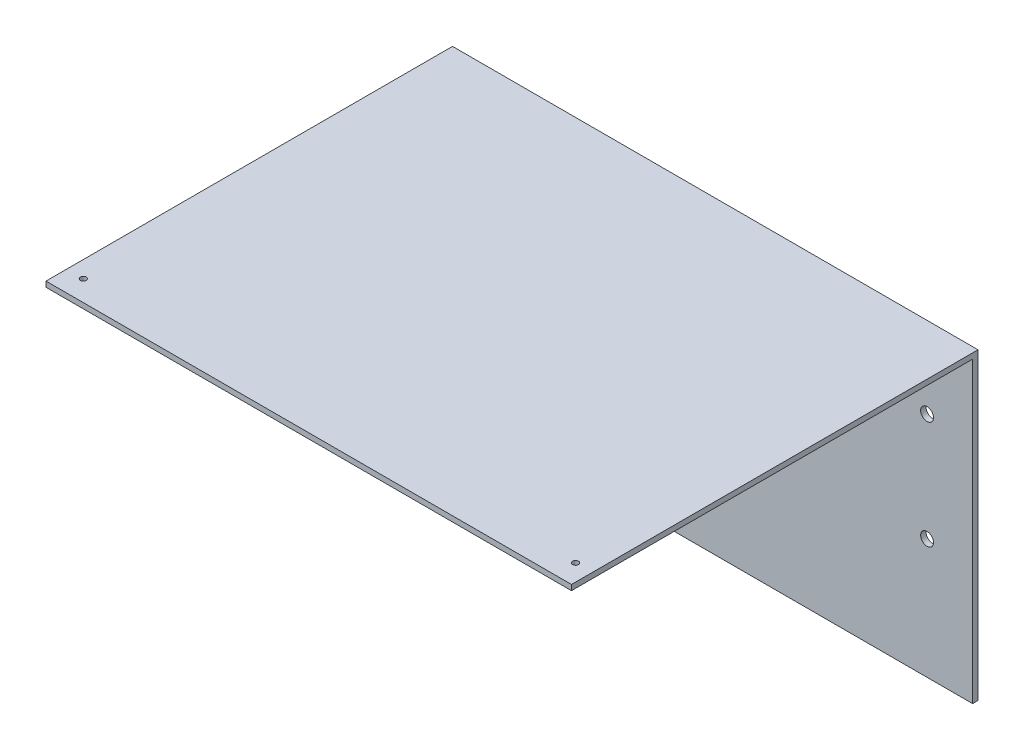
ISO-10303-21;
HEADER;
FILE_DESCRIPTION(('STEP AP214'),'2;1');
FILE_NAME('part.step','',(''),(''),'','','');
FILE_SCHEMA(('AUTOMOTIVE_DESIGN { 1 0 10303 214 1 1 1 1 }'));
ENDSEC;
DATA;
#1=APPLICATION_CONTEXT('core data for automotive mechanical design processes');
#2=APPLICATION_PROTOCOL_DEFINITION('international standard','automotive_design',2000,#1);
#3=PRODUCT_CONTEXT('',#1,'mechanical');
#4=PRODUCT('Part','Part','',(#3));
#5=PRODUCT_RELATED_PRODUCT_CATEGORY('part','',(#4));
#6=PRODUCT_DEFINITION_FORMATION('','',#4);
#7=PRODUCT_DEFINITION_CONTEXT('part definition',#1,'design');
#8=PRODUCT_DEFINITION('design','',#6,#7);
#9=PRODUCT_DEFINITION_SHAPE('','',#8);
#10=(LENGTH_UNIT() NAMED_UNIT(*) SI_UNIT(.MILLI.,.METRE.));
#11=(NAMED_UNIT(*) PLANE_ANGLE_UNIT() SI_UNIT($,.RADIAN.));
#12=(NAMED_UNIT(*) SI_UNIT($,.STERADIAN.) SOLID_ANGLE_UNIT());
#13=UNCERTAINTY_MEASURE_WITH_UNIT(LENGTH_MEASURE(1.E-05),#10,'distance_accuracy_value','');
#14=(GEOMETRIC_REPRESENTATION_CONTEXT(3) GLOBAL_UNCERTAINTY_ASSIGNED_CONTEXT((#13)) GLOBAL_UNIT_ASSIGNED_CONTEXT((#10,
#11,#12)) REPRESENTATION_CONTEXT('',''));
#15=CARTESIAN_POINT('',(0.,0.,0.));
#16=DIRECTION('',(0.,0.,1.));
#17=DIRECTION('',(1.,0.,0.));
#18=AXIS2_PLACEMENT_3D('',#15,#16,#17);
#19=CARTESIAN_POINT('',(0.,0.,3.));
#20=DIRECTION('',(0.,-1.,0.));
#21=DIRECTION('',(0.,0.,-1.));
#22=AXIS2_PLACEMENT_3D('',#19,#20,#21);
#23=PLANE('',#22);
#24=DIRECTION('',(-1.,0.,0.));
#25=VECTOR('',#24,1.);
#26=CARTESIAN_POINT('',(0.,0.,0.));
#27=LINE('',#26,#25);
#28=CARTESIAN_POINT('',(291.5,0.,0.));
#29=VERTEX_POINT('',#28);
#30=CARTESIAN_POINT('',(0.,0.,0.));
#31=VERTEX_POINT('',#30);
#32=EDGE_CURVE('E93',#29,#31,#27,.T.);
#33=ORIENTED_EDGE('',*,*,#32,.T.);
#34=DIRECTION('',(0.,0.,-1.));
#35=VECTOR('',#34,1.);
#36=CARTESIAN_POINT('',(0.,0.,3.));
#37=LINE('',#36,#35);
#38=CARTESIAN_POINT('',(0.,0.,225.5));
#39=VERTEX_POINT('',#38);
#40=EDGE_CURVE('E97',#39,#31,#37,.T.);
#41=ORIENTED_EDGE('',*,*,#40,.F.);
#42=DIRECTION('',(-1.,0.,0.));
#43=VECTOR('',#42,1.);
#44=CARTESIAN_POINT('',(0.,0.,225.5));
#45=LINE('',#44,#43);
#46=CARTESIAN_POINT('',(291.5,0.,225.5));
#47=VERTEX_POINT('',#46);
#48=EDGE_CURVE('E165',#47,#39,#45,.T.);
#49=ORIENTED_EDGE('',*,*,#48,.F.);
#50=DIRECTION('',(0.,0.,-1.));
#51=VECTOR('',#50,1.);
#52=CARTESIAN_POINT('',(291.5,0.,3.));
#53=LINE('',#52,#51);
#54=EDGE_CURVE('E100',#47,#29,#53,.T.);
#55=ORIENTED_EDGE('',*,*,#54,.T.);
#56=EDGE_LOOP('',(#33,#41,#49,#55));
#57=FACE_BOUND('',#56,.T.);
#58=CARTESIAN_POINT('',(282.25,0.,214.));
#59=DIRECTION('',(0.,1.,0.));
#60=DIRECTION('',(0.,0.,1.));
#61=AXIS2_PLACEMENT_3D('',#58,#59,#60);
#62=CIRCLE('',#61,1.64999999999998);
#63=CARTESIAN_POINT('',(282.25,0.,215.65));
#64=VERTEX_POINT('',#63);
#65=EDGE_CURVE('E217',#64,#64,#62,.T.);
#66=ORIENTED_EDGE('',*,*,#65,.F.);
#67=EDGE_LOOP('',(#66));
#68=FACE_BOUND('',#67,.T.);
#69=CARTESIAN_POINT('',(9.24999999999998,0.,214.));
#70=DIRECTION('',(0.,1.,0.));
#71=DIRECTION('',(0.,0.,1.));
#72=AXIS2_PLACEMENT_3D('',#69,#70,#71);
#73=CIRCLE('',#72,1.64999999999999);
#74=CARTESIAN_POINT('',(9.24999999999998,0.,215.65));
#75=VERTEX_POINT('',#74);
#76=EDGE_CURVE('E229',#75,#75,#73,.T.);
#77=ORIENTED_EDGE('',*,*,#76,.F.);
#78=EDGE_LOOP('',(#77));
#79=FACE_BOUND('',#78,.T.);
#80=ADVANCED_FACE('F51',(#57,#68,#79),#23,.F.);
#81=CARTESIAN_POINT('',(0.,0.,3.));
#82=DIRECTION('',(1.,0.,0.));
#83=DIRECTION('',(0.,1.,0.));
#84=AXIS2_PLACEMENT_3D('',#81,#82,#83);
#85=PLANE('',#84);
#86=DIRECTION('',(0.,-1.,0.));
#87=VECTOR('',#86,1.);
#88=CARTESIAN_POINT('',(0.,0.,0.));
#89=LINE('',#88,#87);
#90=CARTESIAN_POINT('',(0.,-168.5,0.));
#91=VERTEX_POINT('',#90);
#92=EDGE_CURVE('E112',#31,#91,#89,.T.);
#93=ORIENTED_EDGE('',*,*,#92,.T.);
#94=DIRECTION('',(0.,0.,-1.));
#95=VECTOR('',#94,1.);
#96=CARTESIAN_POINT('',(0.,-168.5,3.));
#97=LINE('',#96,#95);
#98=CARTESIAN_POINT('',(0.,-168.5,3.));
#99=VERTEX_POINT('',#98);
#100=EDGE_CURVE('E11',#99,#91,#97,.T.);
#101=ORIENTED_EDGE('',*,*,#100,.F.);
#102=DIRECTION('',(0.,-1.,0.));
#103=VECTOR('',#102,1.);
#104=CARTESIAN_POINT('',(0.,0.,3.));
#105=LINE('',#104,#103);
#106=CARTESIAN_POINT('',(0.,-3.,3.));
#107=VERTEX_POINT('',#106);
#108=EDGE_CURVE('E105',#107,#99,#105,.T.);
#109=ORIENTED_EDGE('',*,*,#108,.F.);
#110=DIRECTION('',(0.,0.,-1.));
#111=VECTOR('',#110,1.);
#112=CARTESIAN_POINT('',(0.,-3.,225.5));
#113=LINE('',#112,#111);
#114=CARTESIAN_POINT('',(0.,-3.,225.5));
#115=VERTEX_POINT('',#114);
#116=EDGE_CURVE('E146',#115,#107,#113,.T.);
#117=ORIENTED_EDGE('',*,*,#116,.F.);
#118=DIRECTION('',(0.,-1.,0.));
#119=VECTOR('',#118,1.);
#120=CARTESIAN_POINT('',(0.,0.,225.5));
#121=LINE('',#120,#119);
#122=EDGE_CURVE('E115',#39,#115,#121,.T.);
#123=ORIENTED_EDGE('',*,*,#122,.F.);
#124=ORIENTED_EDGE('',*,*,#40,.T.);
#125=EDGE_LOOP('',(#93,#101,#109,#117,#123,#124));
#126=FACE_BOUND('',#125,.T.);
#127=ADVANCED_FACE('F53',(#126),#85,.F.);
#128=CARTESIAN_POINT('',(0.,-168.5,3.));
#129=DIRECTION('',(0.,1.,0.));
#130=DIRECTION('',(0.,0.,1.));
#131=AXIS2_PLACEMENT_3D('',#128,#129,#130);
#132=PLANE('',#131);
#133=DIRECTION('',(1.,0.,0.));
#134=VECTOR('',#133,1.);
#135=CARTESIAN_POINT('',(0.,-168.5,0.));
#136=LINE('',#135,#134);
#137=CARTESIAN_POINT('',(291.5,-168.5,0.));
#138=VERTEX_POINT('',#137);
#139=EDGE_CURVE('E120',#91,#138,#136,.T.);
#140=ORIENTED_EDGE('',*,*,#139,.T.);
#141=DIRECTION('',(0.,0.,-1.));
#142=VECTOR('',#141,1.);
#143=CARTESIAN_POINT('',(291.5,-168.5,3.));
#144=LINE('',#143,#142);
#145=CARTESIAN_POINT('',(291.5,-168.5,3.));
#146=VERTEX_POINT('',#145);
#147=EDGE_CURVE('E60',#146,#138,#144,.T.);
#148=ORIENTED_EDGE('',*,*,#147,.F.);
#149=DIRECTION('',(1.,0.,0.));
#150=VECTOR('',#149,1.);
#151=CARTESIAN_POINT('',(0.,-168.5,3.));
#152=LINE('',#151,#150);
#153=EDGE_CURVE('E73',#99,#146,#152,.T.);
#154=ORIENTED_EDGE('',*,*,#153,.F.);
#155=ORIENTED_EDGE('',*,*,#100,.T.);
#156=EDGE_LOOP('',(#140,#148,#154,#155));
#157=FACE_BOUND('',#156,.T.);
#158=ADVANCED_FACE('F143',(#157),#132,.F.);
#159=CARTESIAN_POINT('',(291.5,0.,3.));
#160=DIRECTION('',(-1.,0.,0.));
#161=DIRECTION('',(0.,0.,1.));
#162=AXIS2_PLACEMENT_3D('',#159,#160,#161);
#163=PLANE('',#162);
#164=DIRECTION('',(0.,1.,0.));
#165=VECTOR('',#164,1.);
#166=CARTESIAN_POINT('',(291.5,0.,0.));
#167=LINE('',#166,#165);
#168=EDGE_CURVE('E106',#138,#29,#167,.T.);
#169=ORIENTED_EDGE('',*,*,#168,.T.);
#170=ORIENTED_EDGE('',*,*,#54,.F.);
#171=DIRECTION('',(0.,1.,0.));
#172=VECTOR('',#171,1.);
#173=CARTESIAN_POINT('',(291.5,0.,225.5));
#174=LINE('',#173,#172);
#175=CARTESIAN_POINT('',(291.5,-3.,225.5));
#176=VERTEX_POINT('',#175);
#177=EDGE_CURVE('E204',#176,#47,#174,.T.);
#178=ORIENTED_EDGE('',*,*,#177,.F.);
#179=DIRECTION('',(0.,0.,-1.));
#180=VECTOR('',#179,1.);
#181=CARTESIAN_POINT('',(291.5,-3.,225.5));
#182=LINE('',#181,#180);
#183=CARTESIAN_POINT('',(291.5,-3.,3.));
#184=VERTEX_POINT('',#183);
#185=EDGE_CURVE('E158',#176,#184,#182,.T.);
#186=ORIENTED_EDGE('',*,*,#185,.T.);
#187=DIRECTION('',(0.,1.,0.));
#188=VECTOR('',#187,1.);
#189=CARTESIAN_POINT('',(291.5,0.,3.));
#190=LINE('',#189,#188);
#191=EDGE_CURVE('E117',#146,#184,#190,.T.);
#192=ORIENTED_EDGE('',*,*,#191,.F.);
#193=ORIENTED_EDGE('',*,*,#147,.T.);
#194=EDGE_LOOP('',(#169,#170,#178,#186,#192,#193));
#195=FACE_BOUND('',#194,.T.);
#196=ADVANCED_FACE('F140',(#195),#163,.F.);
#197=CARTESIAN_POINT('',(0.,0.,3.));
#198=DIRECTION('',(0.,0.,1.));
#199=DIRECTION('',(1.,0.,0.));
#200=AXIS2_PLACEMENT_3D('',#197,#198,#199);
#201=PLANE('',#200);
#202=DIRECTION('',(1.,0.,0.));
#203=VECTOR('',#202,1.);
#204=CARTESIAN_POINT('',(0.,-3.,3.));
#205=LINE('',#204,#203);
#206=EDGE_CURVE('E67',#107,#184,#205,.T.);
#207=ORIENTED_EDGE('',*,*,#206,.F.);
#208=ORIENTED_EDGE('',*,*,#108,.T.);
#209=ORIENTED_EDGE('',*,*,#153,.T.);
#210=ORIENTED_EDGE('',*,*,#191,.T.);
#211=EDGE_LOOP('',(#207,#208,#209,#210));
#212=FACE_BOUND('',#211,.T.);
#213=CARTESIAN_POINT('',(25.25,-102.,3.));
#214=DIRECTION('',(0.,0.,1.));
#215=DIRECTION('',(1.,0.,0.));
#216=AXIS2_PLACEMENT_3D('',#213,#214,#215);
#217=CIRCLE('',#216,3.57124);
#218=CARTESIAN_POINT('',(28.82124,-102.,3.));
#219=VERTEX_POINT('',#218);
#220=EDGE_CURVE('E157',#219,#219,#217,.T.);
#221=ORIENTED_EDGE('',*,*,#220,.F.);
#222=EDGE_LOOP('',(#221));
#223=FACE_BOUND('',#222,.T.);
#224=CARTESIAN_POINT('',(25.25,-42.,3.));
#225=DIRECTION('',(0.,0.,1.));
#226=DIRECTION('',(1.,0.,0.));
#227=AXIS2_PLACEMENT_3D('',#224,#225,#226);
#228=CIRCLE('',#227,3.57124);
#229=CARTESIAN_POINT('',(28.82124,-42.,3.));
#230=VERTEX_POINT('',#229);
#231=EDGE_CURVE('E172',#230,#230,#228,.T.);
#232=ORIENTED_EDGE('',*,*,#231,.F.);
#233=EDGE_LOOP('',(#232));
#234=FACE_BOUND('',#233,.T.);
#235=CARTESIAN_POINT('',(266.25,-42.,3.));
#236=DIRECTION('',(0.,0.,1.));
#237=DIRECTION('',(1.,0.,0.));
#238=AXIS2_PLACEMENT_3D('',#235,#236,#237);
#239=CIRCLE('',#238,3.57123999999998);
#240=CARTESIAN_POINT('',(269.82124,-42.,3.));
#241=VERTEX_POINT('',#240);
#242=EDGE_CURVE('E180',#241,#241,#239,.T.);
#243=ORIENTED_EDGE('',*,*,#242,.F.);
#244=EDGE_LOOP('',(#243));
#245=FACE_BOUND('',#244,.T.);
#246=CARTESIAN_POINT('',(266.25,-102.,3.));
#247=DIRECTION('',(0.,0.,1.));
#248=DIRECTION('',(1.,0.,0.));
#249=AXIS2_PLACEMENT_3D('',#246,#247,#248);
#250=CIRCLE('',#249,3.57123999999998);
#251=CARTESIAN_POINT('',(269.82124,-102.,3.));
#252=VERTEX_POINT('',#251);
#253=EDGE_CURVE('E128',#252,#252,#250,.T.);
#254=ORIENTED_EDGE('',*,*,#253,.F.);
#255=EDGE_LOOP('',(#254));
#256=FACE_BOUND('',#255,.T.);
#257=ADVANCED_FACE('F192',(#212,#223,#234,#245,#256),#201,.T.);
#258=CARTESIAN_POINT('',(0.,0.,0.));
#259=DIRECTION('',(0.,0.,1.));
#260=DIRECTION('',(1.,0.,0.));
#261=AXIS2_PLACEMENT_3D('',#258,#259,#260);
#262=PLANE('',#261);
#263=CARTESIAN_POINT('',(25.25,-102.,0.));
#264=DIRECTION('',(0.,0.,1.));
#265=DIRECTION('',(1.,0.,0.));
#266=AXIS2_PLACEMENT_3D('',#263,#264,#265);
#267=CIRCLE('',#266,3.57124);
#268=CARTESIAN_POINT('',(28.82124,-102.,0.));
#269=VERTEX_POINT('',#268);
#270=EDGE_CURVE('E163',#269,#269,#267,.T.);
#271=ORIENTED_EDGE('',*,*,#270,.T.);
#272=EDGE_LOOP('',(#271));
#273=FACE_BOUND('',#272,.T.);
#274=CARTESIAN_POINT('',(25.25,-42.,0.));
#275=DIRECTION('',(0.,0.,1.));
#276=DIRECTION('',(1.,0.,0.));
#277=AXIS2_PLACEMENT_3D('',#274,#275,#276);
#278=CIRCLE('',#277,3.57124);
#279=CARTESIAN_POINT('',(28.82124,-42.,0.));
#280=VERTEX_POINT('',#279);
#281=EDGE_CURVE('E176',#280,#280,#278,.T.);
#282=ORIENTED_EDGE('',*,*,#281,.T.);
#283=EDGE_LOOP('',(#282));
#284=FACE_BOUND('',#283,.T.);
#285=CARTESIAN_POINT('',(266.25,-42.,0.));
#286=DIRECTION('',(0.,0.,1.));
#287=DIRECTION('',(1.,0.,0.));
#288=AXIS2_PLACEMENT_3D('',#285,#286,#287);
#289=CIRCLE('',#288,3.57123999999998);
#290=CARTESIAN_POINT('',(269.82124,-42.,0.));
#291=VERTEX_POINT('',#290);
#292=EDGE_CURVE('E184',#291,#291,#289,.T.);
#293=ORIENTED_EDGE('',*,*,#292,.T.);
#294=EDGE_LOOP('',(#293));
#295=FACE_BOUND('',#294,.T.);
#296=CARTESIAN_POINT('',(266.25,-102.,0.));
#297=DIRECTION('',(0.,0.,1.));
#298=DIRECTION('',(1.,0.,0.));
#299=AXIS2_PLACEMENT_3D('',#296,#297,#298);
#300=CIRCLE('',#299,3.57123999999998);
#301=CARTESIAN_POINT('',(269.82124,-102.,0.));
#302=VERTEX_POINT('',#301);
#303=EDGE_CURVE('E122',#302,#302,#300,.T.);
#304=ORIENTED_EDGE('',*,*,#303,.T.);
#305=EDGE_LOOP('',(#304));
#306=FACE_BOUND('',#305,.T.);
#307=ORIENTED_EDGE('',*,*,#92,.F.);
#308=ORIENTED_EDGE('',*,*,#32,.F.);
#309=ORIENTED_EDGE('',*,*,#168,.F.);
#310=ORIENTED_EDGE('',*,*,#139,.F.);
#311=EDGE_LOOP('',(#307,#308,#309,#310));
#312=FACE_BOUND('',#311,.T.);
#313=ADVANCED_FACE('F119',(#273,#284,#295,#306,#312),#262,.F.);
#314=CARTESIAN_POINT('',(266.25,-102.,3.));
#315=DIRECTION('',(0.,0.,1.));
#316=DIRECTION('',(1.,0.,0.));
#317=AXIS2_PLACEMENT_3D('',#314,#315,#316);
#318=CYLINDRICAL_SURFACE('',#317,3.57123999999998);
#319=ORIENTED_EDGE('',*,*,#303,.F.);
#320=EDGE_LOOP('',(#319));
#321=FACE_BOUND('',#320,.T.);
#322=ORIENTED_EDGE('',*,*,#253,.T.);
#323=EDGE_LOOP('',(#322));
#324=FACE_BOUND('',#323,.T.);
#325=ADVANCED_FACE('F259',(#321,#324),#318,.F.);
#326=CARTESIAN_POINT('',(266.25,-42.,3.));
#327=DIRECTION('',(0.,0.,1.));
#328=DIRECTION('',(1.,0.,0.));
#329=AXIS2_PLACEMENT_3D('',#326,#327,#328);
#330=CYLINDRICAL_SURFACE('',#329,3.57123999999998);
#331=ORIENTED_EDGE('',*,*,#292,.F.);
#332=EDGE_LOOP('',(#331));
#333=FACE_BOUND('',#332,.T.);
#334=ORIENTED_EDGE('',*,*,#242,.T.);
#335=EDGE_LOOP('',(#334));
#336=FACE_BOUND('',#335,.T.);
#337=ADVANCED_FACE('F268',(#333,#336),#330,.F.);
#338=CARTESIAN_POINT('',(25.25,-42.,3.));
#339=DIRECTION('',(0.,0.,1.));
#340=DIRECTION('',(1.,0.,0.));
#341=AXIS2_PLACEMENT_3D('',#338,#339,#340);
#342=CYLINDRICAL_SURFACE('',#341,3.57124);
#343=ORIENTED_EDGE('',*,*,#281,.F.);
#344=EDGE_LOOP('',(#343));
#345=FACE_BOUND('',#344,.T.);
#346=ORIENTED_EDGE('',*,*,#231,.T.);
#347=EDGE_LOOP('',(#346));
#348=FACE_BOUND('',#347,.T.);
#349=ADVANCED_FACE('F277',(#345,#348),#342,.F.);
#350=CARTESIAN_POINT('',(25.25,-102.,3.));
#351=DIRECTION('',(0.,0.,1.));
#352=DIRECTION('',(1.,0.,0.));
#353=AXIS2_PLACEMENT_3D('',#350,#351,#352);
#354=CYLINDRICAL_SURFACE('',#353,3.57124);
#355=ORIENTED_EDGE('',*,*,#270,.F.);
#356=EDGE_LOOP('',(#355));
#357=FACE_BOUND('',#356,.T.);
#358=ORIENTED_EDGE('',*,*,#220,.T.);
#359=EDGE_LOOP('',(#358));
#360=FACE_BOUND('',#359,.T.);
#361=ADVANCED_FACE('F286',(#357,#360),#354,.F.);
#362=CARTESIAN_POINT('',(0.,-3.,225.5));
#363=DIRECTION('',(0.,1.,0.));
#364=DIRECTION('',(0.,0.,1.));
#365=AXIS2_PLACEMENT_3D('',#362,#363,#364);
#366=PLANE('',#365);
#367=CARTESIAN_POINT('',(9.24999999999998,-3.,214.));
#368=DIRECTION('',(0.,1.,0.));
#369=DIRECTION('',(0.,0.,1.));
#370=AXIS2_PLACEMENT_3D('',#367,#368,#369);
#371=CIRCLE('',#370,1.64999999999999);
#372=CARTESIAN_POINT('',(9.24999999999998,-3.,215.65));
#373=VERTEX_POINT('',#372);
#374=EDGE_CURVE('E223',#373,#373,#371,.T.);
#375=ORIENTED_EDGE('',*,*,#374,.T.);
#376=EDGE_LOOP('',(#375));
#377=FACE_BOUND('',#376,.T.);
#378=CARTESIAN_POINT('',(282.25,-3.,214.));
#379=DIRECTION('',(0.,1.,0.));
#380=DIRECTION('',(0.,0.,1.));
#381=AXIS2_PLACEMENT_3D('',#378,#379,#380);
#382=CIRCLE('',#381,1.64999999999998);
#383=CARTESIAN_POINT('',(282.25,-3.,215.65));
#384=VERTEX_POINT('',#383);
#385=EDGE_CURVE('E213',#384,#384,#382,.T.);
#386=ORIENTED_EDGE('',*,*,#385,.T.);
#387=EDGE_LOOP('',(#386));
#388=FACE_BOUND('',#387,.T.);
#389=ORIENTED_EDGE('',*,*,#206,.T.);
#390=ORIENTED_EDGE('',*,*,#185,.F.);
#391=DIRECTION('',(1.,0.,0.));
#392=VECTOR('',#391,1.);
#393=CARTESIAN_POINT('',(0.,-3.,225.5));
#394=LINE('',#393,#392);
#395=EDGE_CURVE('E155',#115,#176,#394,.T.);
#396=ORIENTED_EDGE('',*,*,#395,.F.);
#397=ORIENTED_EDGE('',*,*,#116,.T.);
#398=EDGE_LOOP('',(#389,#390,#396,#397));
#399=FACE_BOUND('',#398,.T.);
#400=ADVANCED_FACE('F151',(#377,#388,#399),#366,.F.);
#401=CARTESIAN_POINT('',(0.,0.,225.5));
#402=DIRECTION('',(0.,0.,1.));
#403=DIRECTION('',(1.,0.,0.));
#404=AXIS2_PLACEMENT_3D('',#401,#402,#403);
#405=PLANE('',#404);
#406=ORIENTED_EDGE('',*,*,#122,.T.);
#407=ORIENTED_EDGE('',*,*,#395,.T.);
#408=ORIENTED_EDGE('',*,*,#177,.T.);
#409=ORIENTED_EDGE('',*,*,#48,.T.);
#410=EDGE_LOOP('',(#406,#407,#408,#409));
#411=FACE_BOUND('',#410,.T.);
#412=ADVANCED_FACE('F202',(#411),#405,.T.);
#413=CARTESIAN_POINT('',(282.25,0.,214.));
#414=DIRECTION('',(0.,1.,0.));
#415=DIRECTION('',(0.,0.,1.));
#416=AXIS2_PLACEMENT_3D('',#413,#414,#415);
#417=CYLINDRICAL_SURFACE('',#416,1.64999999999998);
#418=ORIENTED_EDGE('',*,*,#385,.F.);
#419=EDGE_LOOP('',(#418));
#420=FACE_BOUND('',#419,.T.);
#421=ORIENTED_EDGE('',*,*,#65,.T.);
#422=EDGE_LOOP('',(#421));
#423=FACE_BOUND('',#422,.T.);
#424=ADVANCED_FACE('F319',(#420,#423),#417,.F.);
#425=CARTESIAN_POINT('',(9.24999999999998,0.,214.));
#426=DIRECTION('',(0.,1.,0.));
#427=DIRECTION('',(0.,0.,1.));
#428=AXIS2_PLACEMENT_3D('',#425,#426,#427);
#429=CYLINDRICAL_SURFACE('',#428,1.64999999999999);
#430=ORIENTED_EDGE('',*,*,#374,.F.);
#431=EDGE_LOOP('',(#430));
#432=FACE_BOUND('',#431,.T.);
#433=ORIENTED_EDGE('',*,*,#76,.T.);
#434=EDGE_LOOP('',(#433));
#435=FACE_BOUND('',#434,.T.);
#436=ADVANCED_FACE('F234',(#432,#435),#429,.F.);
#437=CLOSED_SHELL('',(#80,#127,#158,#196,#257,#313,#325,#337,#349,#361,#400,#412,#424,#436));
#438=MANIFOLD_SOLID_BREP('B2',#437);
#439=ADVANCED_BREP_SHAPE_REPRESENTATION('',(#18,#438),#14);
#440=SHAPE_DEFINITION_REPRESENTATION(#9,#439);
ENDSEC;
END-ISO-10303-21;
